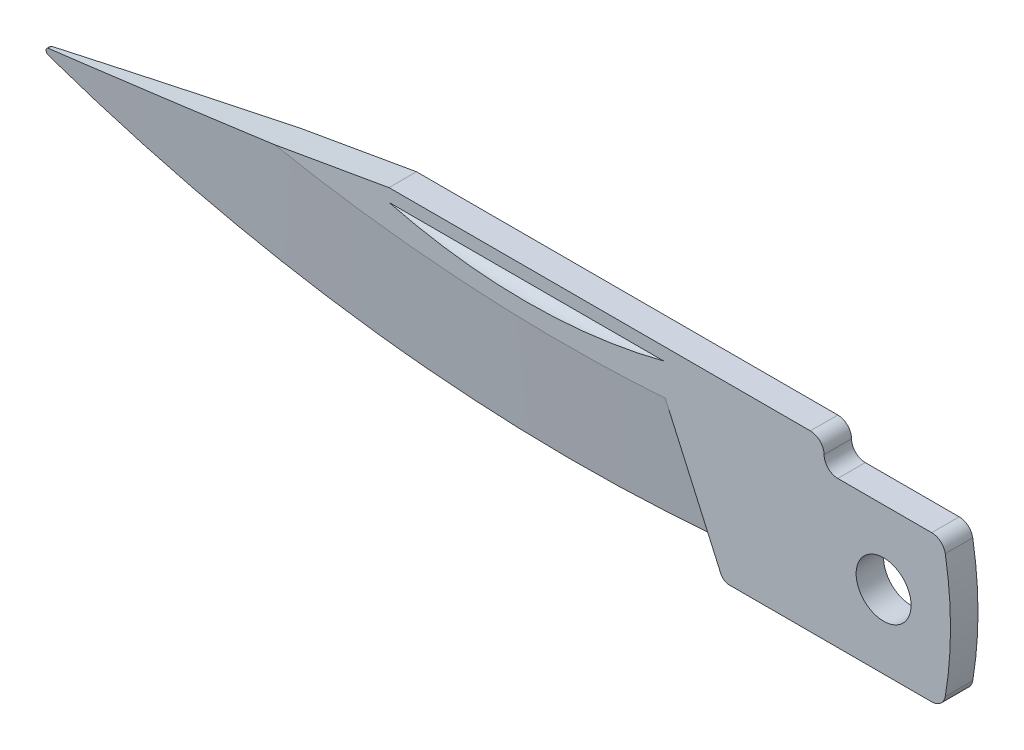
ISO-10303-21;
HEADER;
FILE_DESCRIPTION(('STEP AP214'),'2;1');
FILE_NAME('part.step','',(''),(''),'','','');
FILE_SCHEMA(('AUTOMOTIVE_DESIGN { 1 0 10303 214 1 1 1 1 }'));
ENDSEC;
DATA;
#1=APPLICATION_CONTEXT('core data for automotive mechanical design processes');
#2=APPLICATION_PROTOCOL_DEFINITION('international standard','automotive_design',2000,#1);
#3=PRODUCT_CONTEXT('',#1,'mechanical');
#4=PRODUCT('Part','Part','',(#3));
#5=PRODUCT_RELATED_PRODUCT_CATEGORY('part','',(#4));
#6=PRODUCT_DEFINITION_FORMATION('','',#4);
#7=PRODUCT_DEFINITION_CONTEXT('part definition',#1,'design');
#8=PRODUCT_DEFINITION('design','',#6,#7);
#9=PRODUCT_DEFINITION_SHAPE('','',#8);
#10=(LENGTH_UNIT() NAMED_UNIT(*) SI_UNIT(.MILLI.,.METRE.));
#11=(NAMED_UNIT(*) PLANE_ANGLE_UNIT() SI_UNIT($,.RADIAN.));
#12=(NAMED_UNIT(*) SI_UNIT($,.STERADIAN.) SOLID_ANGLE_UNIT());
#13=UNCERTAINTY_MEASURE_WITH_UNIT(LENGTH_MEASURE(1.E-05),#10,'distance_accuracy_value','');
#14=(GEOMETRIC_REPRESENTATION_CONTEXT(3) GLOBAL_UNCERTAINTY_ASSIGNED_CONTEXT((#13)) GLOBAL_UNIT_ASSIGNED_CONTEXT((#10,
#11,#12)) REPRESENTATION_CONTEXT('',''));
#15=CARTESIAN_POINT('',(0.,0.,0.));
#16=DIRECTION('',(0.,0.,1.));
#17=DIRECTION('',(1.,0.,0.));
#18=AXIS2_PLACEMENT_3D('',#15,#16,#17);
#19=CARTESIAN_POINT('',(-16.3459179422654,0.,0.75));
#20=DIRECTION('',(0.,0.,-1.));
#21=DIRECTION('',(-1.,0.,0.));
#22=AXIS2_PLACEMENT_3D('',#19,#20,#21);
#23=PLANE('',#22);
#24=DIRECTION('',(-1.,0.,0.));
#25=VECTOR('',#24,1.);
#26=CARTESIAN_POINT('',(-27.,4.8,0.75));
#27=LINE('',#26,#25);
#28=CARTESIAN_POINT('',(-12.,4.8,0.75));
#29=VERTEX_POINT('',#28);
#30=CARTESIAN_POINT('',(-27.,4.8,0.75));
#31=VERTEX_POINT('',#30);
#32=EDGE_CURVE('E149',#29,#31,#27,.T.);
#33=ORIENTED_EDGE('',*,*,#32,.F.);
#34=CARTESIAN_POINT('',(-19.5,33.8473750965556,0.75));
#35=DIRECTION('',(0.,0.,1.));
#36=DIRECTION('',(-1.,0.,0.));
#37=AXIS2_PLACEMENT_3D('',#34,#35,#36);
#38=CIRCLE('',#37,30.);
#39=EDGE_CURVE('E160',#31,#29,#38,.T.);
#40=ORIENTED_EDGE('',*,*,#39,.F.);
#41=EDGE_LOOP('',(#33,#40));
#42=FACE_BOUND('',#41,.T.);
#43=CARTESIAN_POINT('',(0.,0.,0.75));
#44=DIRECTION('',(0.,0.,1.));
#45=DIRECTION('',(1.,0.,0.));
#46=AXIS2_PLACEMENT_3D('',#43,#44,#45);
#47=CIRCLE('',#46,1.5);
#48=CARTESIAN_POINT('',(1.5,0.,0.75));
#49=VERTEX_POINT('',#48);
#50=EDGE_CURVE('E453',#49,#49,#47,.T.);
#51=ORIENTED_EDGE('',*,*,#50,.F.);
#52=EDGE_LOOP('',(#51));
#53=FACE_BOUND('',#52,.T.);
#54=DIRECTION('',(0.408366060058254,-0.91281825189492,0.));
#55=VECTOR('',#54,1.);
#56=CARTESIAN_POINT('',(-8.75,-4.,0.75));
#57=LINE('',#56,#55);
#58=CARTESIAN_POINT('',(-11.9180941663228,3.08162140985568,0.750000000000002));
#59=VERTEX_POINT('',#58);
#60=CARTESIAN_POINT('',(-8.88233917077645,-3.70418303002913,0.75));
#61=VERTEX_POINT('',#60);
#62=EDGE_CURVE('E466',#59,#61,#57,.T.);
#63=ORIENTED_EDGE('',*,*,#62,.T.);
#64=CARTESIAN_POINT('',(-8.42593004482898,-3.5,0.75));
#65=DIRECTION('',(0.,0.,-1.));
#66=DIRECTION('',(-1.,0.,0.));
#67=AXIS2_PLACEMENT_3D('',#64,#65,#66);
#68=CIRCLE('',#67,0.5);
#69=CARTESIAN_POINT('',(-8.42593004482898,-4.,0.75));
#70=VERTEX_POINT('',#69);
#71=EDGE_CURVE('E11',#61,#70,#68,.F.);
#72=ORIENTED_EDGE('',*,*,#71,.T.);
#73=DIRECTION('',(1.,0.,0.));
#74=VECTOR('',#73,1.);
#75=CARTESIAN_POINT('',(3.25,-4.,0.75));
#76=LINE('',#75,#74);
#77=CARTESIAN_POINT('',(2.62774801874485,-4.,0.75));
#78=VERTEX_POINT('',#77);
#79=EDGE_CURVE('E405',#70,#78,#76,.T.);
#80=ORIENTED_EDGE('',*,*,#79,.T.);
#81=CARTESIAN_POINT('',(2.62774801874485,-3.25,0.75));
#82=DIRECTION('',(0.,0.,-1.));
#83=DIRECTION('',(-1.,0.,0.));
#84=AXIS2_PLACEMENT_3D('',#81,#82,#83);
#85=CIRCLE('',#84,0.75);
#86=CARTESIAN_POINT('',(3.36698175748551,-3.37662337662338,0.75));
#87=VERTEX_POINT('',#86);
#88=EDGE_CURVE('E384',#78,#87,#85,.F.);
#89=ORIENTED_EDGE('',*,*,#88,.T.);
#90=CARTESIAN_POINT('',(-16.3459179422654,0.,0.75));
#91=DIRECTION('',(0.,0.,1.));
#92=DIRECTION('',(-1.,0.,0.));
#93=AXIS2_PLACEMENT_3D('',#90,#91,#92);
#94=CIRCLE('',#93,20.);
#95=CARTESIAN_POINT('',(3.36698175748551,3.37662337662338,0.75));
#96=VERTEX_POINT('',#95);
#97=EDGE_CURVE('E446',#87,#96,#94,.T.);
#98=ORIENTED_EDGE('',*,*,#97,.T.);
#99=CARTESIAN_POINT('',(2.62774801874485,3.25,0.75));
#100=DIRECTION('',(0.,0.,-1.));
#101=DIRECTION('',(-1.,0.,0.));
#102=AXIS2_PLACEMENT_3D('',#99,#100,#101);
#103=CIRCLE('',#102,0.75);
#104=CARTESIAN_POINT('',(2.62774801874485,4.,0.75));
#105=VERTEX_POINT('',#104);
#106=EDGE_CURVE('E382',#96,#105,#103,.F.);
#107=ORIENTED_EDGE('',*,*,#106,.T.);
#108=DIRECTION('',(-1.,0.,0.));
#109=VECTOR('',#108,1.);
#110=CARTESIAN_POINT('',(-3.25,4.,0.75));
#111=LINE('',#110,#109);
#112=CARTESIAN_POINT('',(-2.5,4.,0.75));
#113=VERTEX_POINT('',#112);
#114=EDGE_CURVE('E443',#105,#113,#111,.T.);
#115=ORIENTED_EDGE('',*,*,#114,.T.);
#116=CARTESIAN_POINT('',(-2.5,4.75,0.75));
#117=DIRECTION('',(0.,0.,-1.));
#118=DIRECTION('',(-1.,0.,0.));
#119=AXIS2_PLACEMENT_3D('',#116,#117,#118);
#120=CIRCLE('',#119,0.75);
#121=CARTESIAN_POINT('',(-3.25,4.75,0.75));
#122=VERTEX_POINT('',#121);
#123=EDGE_CURVE('E396',#113,#122,#120,.T.);
#124=ORIENTED_EDGE('',*,*,#123,.T.);
#125=CARTESIAN_POINT('',(-4.,4.75,0.75));
#126=DIRECTION('',(0.,0.,-1.));
#127=DIRECTION('',(-1.,0.,0.));
#128=AXIS2_PLACEMENT_3D('',#125,#126,#127);
#129=CIRCLE('',#128,0.75);
#130=CARTESIAN_POINT('',(-4.,5.5,0.75));
#131=VERTEX_POINT('',#130);
#132=EDGE_CURVE('E380',#122,#131,#129,.F.);
#133=ORIENTED_EDGE('',*,*,#132,.T.);
#134=DIRECTION('',(-1.,0.,0.));
#135=VECTOR('',#134,1.);
#136=CARTESIAN_POINT('',(-13.,5.5,0.75));
#137=LINE('',#136,#135);
#138=CARTESIAN_POINT('',(-27.,5.5,0.75));
#139=VERTEX_POINT('',#138);
#140=EDGE_CURVE('E424',#131,#139,#137,.T.);
#141=ORIENTED_EDGE('',*,*,#140,.T.);
#142=DIRECTION('',(-0.985030467155704,-0.172380331752248,0.));
#143=VECTOR('',#142,1.);
#144=CARTESIAN_POINT('',(-27.,5.5,0.75));
#145=LINE('',#144,#143);
#146=CARTESIAN_POINT('',(-33.2378126812052,4.40838278078443,0.749999999999946));
#147=VERTEX_POINT('',#146);
#148=EDGE_CURVE('E425',#139,#147,#145,.T.);
#149=ORIENTED_EDGE('',*,*,#148,.T.);
#150=CARTESIAN_POINT('',(-48.4118995852558,8.91426390720311,0.750000000000003));
#151=CARTESIAN_POINT('',(-47.6273473826281,8.6041792015523,0.750000000000003));
#152=CARTESIAN_POINT('',(-46.8445950996885,8.3029019324848,0.750000000000003));
#153=CARTESIAN_POINT('',(-45.2827052618719,7.72469085103924,0.750000000000003));
#154=CARTESIAN_POINT('',(-44.5052915096354,7.44853873558781,0.750000000000003));
#155=CARTESIAN_POINT('',(-42.9474323015971,6.92386391716868,0.750000000000003));
#156=CARTESIAN_POINT('',(-42.1599239030951,6.67133722632486,0.750000000000003));
#157=CARTESIAN_POINT('',(-40.5791430949942,6.19111776470088,0.750000000000003));
#158=CARTESIAN_POINT('',(-39.7840821385603,5.96262018037788,0.750000000000051));
#159=CARTESIAN_POINT('',(-35.7891504623996,4.87990866051605,0.749999999999811));
#160=CARTESIAN_POINT('',(-32.5253521841167,4.20372394082572,0.750000000000002));
#161=CARTESIAN_POINT('',(-25.9349337441351,3.25386512255557,0.750000000000002));
#162=CARTESIAN_POINT('',(-22.6042335913684,2.97921491743926,0.750000000000001));
#163=CARTESIAN_POINT('',(-15.9499476353999,2.83734182266262,0.750000000000001));
#164=CARTESIAN_POINT('',(-12.6213699597276,2.96954306789259,0.75));
#165=CARTESIAN_POINT('',(-8.8409969324299,3.34927857939747,0.75));
#166=CARTESIAN_POINT('',(-8.34374512547456,3.40335837983422,0.75));
#167=CARTESIAN_POINT('',(-7.84728512130977,3.46091599863165,0.75));
#168=B_SPLINE_CURVE_WITH_KNOTS('',3,(#150,#151,#152,#153,#154,#155,#156,#157,#158,#159,#160,
#161,#162,#163,#164,#165,#166,#167),.UNSPECIFIED.,.F.,.F.,(4,2,2,2,2,2,2,2,4),(0.,
0.0602537035642235,0.120507407128447,0.180761110692671,0.241014814256894,0.482029628513788,
0.723044442770682,0.964059257027577,1.),.UNSPECIFIED.);
#169=EDGE_CURVE('E288',#147,#59,#168,.T.);
#170=ORIENTED_EDGE('',*,*,#169,.T.);
#171=EDGE_LOOP('',(#63,#72,#80,#89,#98,#107,#115,#124,#133,#141,#149,#170));
#172=FACE_BOUND('',#171,.T.);
#173=ADVANCED_FACE('F39',(#42,#53,#172),#23,.F.);
#174=CARTESIAN_POINT('',(-17.5267022797642,84.9175778800511,0.75));
#175=DIRECTION('',(0.,0.,-1.));
#176=DIRECTION('',(-1.,0.,0.));
#177=AXIS2_PLACEMENT_3D('',#174,#175,#176);
#178=CYLINDRICAL_SURFACE('',#177,88.);
#179=CARTESIAN_POINT('',(-51.1462661854821,3.57354866525593,0.0499999999999997));
#180=CARTESIAN_POINT('',(-50.3332171944476,3.24887432494023,0.0499999999999997));
#181=CARTESIAN_POINT('',(-49.5147465972766,2.92957934963637,0.0499999999999998));
#182=CARTESIAN_POINT('',(-47.8665360793661,2.30933094561308,0.0499999999999998));
#183=CARTESIAN_POINT('',(-47.0367960982176,2.0083776621206,0.0500000000000002));
#184=CARTESIAN_POINT('',(-45.3656209410114,1.4323948766627,0.0500000000000002));
#185=CARTESIAN_POINT('',(-44.5245052322645,1.15659307937648,0.0499999999999644));
#186=CARTESIAN_POINT('',(-42.832230770165,0.629890939930534,0.0500000000000365));
#187=CARTESIAN_POINT('',(-41.9810719584124,0.378990737539784,0.0500000000000337));
#188=CARTESIAN_POINT('',(-37.7027021009008,-0.811948004969777,0.0499999999998682));
#189=CARTESIAN_POINT('',(-34.207591273421,-1.56080374322996,0.0500000000000003));
#190=CARTESIAN_POINT('',(-27.1428552370983,-2.628365189016,0.0500000000000003));
#191=CARTESIAN_POINT('',(-23.5733817425332,-2.94703267092562,0.0500000000000002));
#192=CARTESIAN_POINT('',(-16.434189677219,-3.1480711342927,0.0500000000000002));
#193=CARTESIAN_POINT('',(-12.8646352909017,-3.0304569383969,0.0499999999999399));
#194=CARTESIAN_POINT('',(-8.80472058664266,-2.65072141966462,0.050000000000009));
#195=CARTESIAN_POINT('',(-8.27469066528119,-2.59631508974074,0.0499999999999998));
#196=CARTESIAN_POINT('',(-7.74809196639785,-2.53826400517042,0.0499999999999998));
#197=B_SPLINE_CURVE_WITH_KNOTS('',3,(#179,#180,#181,#182,#183,#184,#185,#186,#187,#188,#189,
#190,#191,#192,#193,#194,#195,#196),.UNSPECIFIED.,.F.,.F.,(4,2,2,2,2,2,2,2,4),(0.,
0.0602537035642235,0.120507407128447,0.180761110692671,0.241014814256894,0.482029628513788,
0.723044442770682,0.964059257027577,1.),.UNSPECIFIED.);
#198=CARTESIAN_POINT('',(-46.27574517798,1.7461143718512,0.0500000000000001));
#199=VERTEX_POINT('',#198);
#200=CARTESIAN_POINT('',(-9.33157894736845,-2.70000000000001,0.05));
#201=VERTEX_POINT('',#200);
#202=EDGE_CURVE('E228',#199,#201,#197,.T.);
#203=ORIENTED_EDGE('',*,*,#202,.F.);
#204=DIRECTION('',(0.,0.,-1.));
#205=VECTOR('',#204,1.);
#206=CARTESIAN_POINT('',(-46.2757455314587,1.74611334976765,0.75));
#207=LINE('',#206,#205);
#208=CARTESIAN_POINT('',(-46.27574517798,1.74611437185121,-0.0499999999999998));
#209=VERTEX_POINT('',#208);
#210=EDGE_CURVE('E236',#199,#209,#207,.T.);
#211=ORIENTED_EDGE('',*,*,#210,.T.);
#212=CARTESIAN_POINT('',(-51.1462661854821,3.57354866525593,-0.0500000000000003));
#213=CARTESIAN_POINT('',(-50.3332171944476,3.24887432494023,-0.0500000000000003));
#214=CARTESIAN_POINT('',(-49.5147465972766,2.92957934963637,-0.0500000000000002));
#215=CARTESIAN_POINT('',(-47.8665360793661,2.30933094561308,-0.0500000000000002));
#216=CARTESIAN_POINT('',(-47.0367960982176,2.0083776621206,-0.0499999999999999));
#217=CARTESIAN_POINT('',(-45.3656209410114,1.4323948766627,-0.0499999999999999));
#218=CARTESIAN_POINT('',(-44.5245052322645,1.15659307937648,-0.0500000000000356));
#219=CARTESIAN_POINT('',(-42.832230770165,0.629890939930534,-0.0499999999999636));
#220=CARTESIAN_POINT('',(-41.9810719584124,0.378990737539784,-0.0499999999999663));
#221=CARTESIAN_POINT('',(-37.7027021009008,-0.811948004969777,-0.0500000000001319));
#222=CARTESIAN_POINT('',(-34.207591273421,-1.56080374322996,-0.0499999999999998));
#223=CARTESIAN_POINT('',(-27.1428552370983,-2.628365189016,-0.0499999999999998));
#224=CARTESIAN_POINT('',(-23.5733817425332,-2.94703267092562,-0.0499999999999998));
#225=CARTESIAN_POINT('',(-16.434189677219,-3.1480711342927,-0.0499999999999998));
#226=CARTESIAN_POINT('',(-12.8646352909017,-3.0304569383969,-0.0500000000000601));
#227=CARTESIAN_POINT('',(-8.80472058664266,-2.65072141966462,-0.0499999999999911));
#228=CARTESIAN_POINT('',(-8.27469066528119,-2.59631508974074,-0.0500000000000003));
#229=CARTESIAN_POINT('',(-7.74809196639785,-2.53826400517042,-0.0500000000000003));
#230=B_SPLINE_CURVE_WITH_KNOTS('',3,(#212,#213,#214,#215,#216,#217,#218,#219,#220,#221,#222,
#223,#224,#225,#226,#227,#228,#229),.UNSPECIFIED.,.F.,.F.,(4,2,2,2,2,2,2,2,4),(0.,
0.0602537035642235,0.120507407128447,0.180761110692671,0.241014814256894,0.482029628513788,
0.723044442770682,0.964059257027577,1.),.UNSPECIFIED.);
#231=CARTESIAN_POINT('',(-9.33157894736846,-2.7,-0.0499999999999999));
#232=VERTEX_POINT('',#231);
#233=EDGE_CURVE('E221',#209,#232,#230,.T.);
#234=ORIENTED_EDGE('',*,*,#233,.T.);
#235=DIRECTION('',(0.,0.,-1.));
#236=VECTOR('',#235,1.);
#237=CARTESIAN_POINT('',(-9.33157894736845,-2.70000000000001,0.75));
#238=LINE('',#237,#236);
#239=EDGE_CURVE('E241',#201,#232,#238,.T.);
#240=ORIENTED_EDGE('',*,*,#239,.F.);
#241=EDGE_LOOP('',(#203,#211,#234,#240));
#242=FACE_BOUND('',#241,.T.);
#243=ADVANCED_FACE('F246',(#242),#178,.T.);
#244=CARTESIAN_POINT('',(-16.3459179422654,0.,-0.75));
#245=DIRECTION('',(0.,0.,-1.));
#246=DIRECTION('',(-1.,0.,0.));
#247=AXIS2_PLACEMENT_3D('',#244,#245,#246);
#248=PLANE('',#247);
#249=DIRECTION('',(1.,0.,0.));
#250=VECTOR('',#249,1.);
#251=CARTESIAN_POINT('',(3.25,-4.,-0.75));
#252=LINE('',#251,#250);
#253=CARTESIAN_POINT('',(-8.42593004482898,-4.,-0.75));
#254=VERTEX_POINT('',#253);
#255=CARTESIAN_POINT('',(2.62774801874485,-4.,-0.75));
#256=VERTEX_POINT('',#255);
#257=EDGE_CURVE('E404',#254,#256,#252,.T.);
#258=ORIENTED_EDGE('',*,*,#257,.F.);
#259=CARTESIAN_POINT('',(-8.42593004482898,-3.5,-0.75));
#260=DIRECTION('',(0.,0.,-1.));
#261=DIRECTION('',(-1.,0.,0.));
#262=AXIS2_PLACEMENT_3D('',#259,#260,#261);
#263=CIRCLE('',#262,0.5);
#264=CARTESIAN_POINT('',(-8.88233917077645,-3.70418303002913,-0.75));
#265=VERTEX_POINT('',#264);
#266=EDGE_CURVE('E61',#254,#265,#263,.T.);
#267=ORIENTED_EDGE('',*,*,#266,.T.);
#268=DIRECTION('',(0.408366060058254,-0.91281825189492,0.));
#269=VECTOR('',#268,1.);
#270=CARTESIAN_POINT('',(-8.75,-4.,-0.75));
#271=LINE('',#270,#269);
#272=CARTESIAN_POINT('',(-11.918094213187,3.08162209406134,-0.749999999999997));
#273=VERTEX_POINT('',#272);
#274=EDGE_CURVE('E412',#273,#265,#271,.T.);
#275=ORIENTED_EDGE('',*,*,#274,.F.);
#276=CARTESIAN_POINT('',(-48.4118995852558,8.91426390720311,-0.749999999999998));
#277=CARTESIAN_POINT('',(-47.6273473826281,8.6041792015523,-0.749999999999998));
#278=CARTESIAN_POINT('',(-46.8445950996885,8.3029019324848,-0.749999999999998));
#279=CARTESIAN_POINT('',(-45.2827052618719,7.72469085103924,-0.749999999999998));
#280=CARTESIAN_POINT('',(-44.5052915096354,7.44853873558781,-0.749999999999997));
#281=CARTESIAN_POINT('',(-42.9474323015971,6.92386391716868,-0.749999999999997));
#282=CARTESIAN_POINT('',(-42.1599239030951,6.67133722632486,-0.749999999999997));
#283=CARTESIAN_POINT('',(-40.5791430949942,6.19111776470088,-0.749999999999997));
#284=CARTESIAN_POINT('',(-39.7840821385603,5.96262018037788,-0.749999999999949));
#285=CARTESIAN_POINT('',(-35.7891504623996,4.87990866051605,-0.75000000000019));
#286=CARTESIAN_POINT('',(-32.5253521841167,4.20372394082572,-0.749999999999998));
#287=CARTESIAN_POINT('',(-25.9349337441351,3.25386512255557,-0.749999999999998));
#288=CARTESIAN_POINT('',(-22.6042335913684,2.97921491743926,-0.749999999999999));
#289=CARTESIAN_POINT('',(-15.9499476353999,2.83734182266262,-0.749999999999999));
#290=CARTESIAN_POINT('',(-12.6213699597276,2.96954306789259,-0.75));
#291=CARTESIAN_POINT('',(-8.8409969324299,3.34927857939747,-0.75));
#292=CARTESIAN_POINT('',(-8.34374512547456,3.40335837983422,-0.750000000000001));
#293=CARTESIAN_POINT('',(-7.84728512130977,3.46091599863165,-0.750000000000001));
#294=B_SPLINE_CURVE_WITH_KNOTS('',3,(#276,#277,#278,#279,#280,#281,#282,#283,#284,#285,#286,
#287,#288,#289,#290,#291,#292,#293),.UNSPECIFIED.,.F.,.F.,(4,2,2,2,2,2,2,2,4),(0.,
0.0602537035642235,0.120507407128447,0.180761110692671,0.241014814256894,0.482029628513788,
0.723044442770682,0.964059257027577,1.),.UNSPECIFIED.);
#295=CARTESIAN_POINT('',(-33.2378126812032,4.40838278078665,-0.750000000000054));
#296=VERTEX_POINT('',#295);
#297=EDGE_CURVE('E156',#296,#273,#294,.T.);
#298=ORIENTED_EDGE('',*,*,#297,.F.);
#299=DIRECTION('',(-0.985030467155704,-0.172380331752248,0.));
#300=VECTOR('',#299,1.);
#301=CARTESIAN_POINT('',(-27.,5.5,-0.75));
#302=LINE('',#301,#300);
#303=CARTESIAN_POINT('',(-27.,5.5,-0.75));
#304=VERTEX_POINT('',#303);
#305=EDGE_CURVE('E428',#304,#296,#302,.T.);
#306=ORIENTED_EDGE('',*,*,#305,.F.);
#307=DIRECTION('',(-1.,0.,0.));
#308=VECTOR('',#307,1.);
#309=CARTESIAN_POINT('',(-13.,5.5,-0.75));
#310=LINE('',#309,#308);
#311=CARTESIAN_POINT('',(-4.,5.5,-0.75));
#312=VERTEX_POINT('',#311);
#313=EDGE_CURVE('E417',#312,#304,#310,.T.);
#314=ORIENTED_EDGE('',*,*,#313,.F.);
#315=CARTESIAN_POINT('',(-4.,4.75,-0.75));
#316=DIRECTION('',(0.,0.,-1.));
#317=DIRECTION('',(-1.,0.,0.));
#318=AXIS2_PLACEMENT_3D('',#315,#316,#317);
#319=CIRCLE('',#318,0.75);
#320=CARTESIAN_POINT('',(-3.25,4.75,-0.75));
#321=VERTEX_POINT('',#320);
#322=EDGE_CURVE('E370',#312,#321,#319,.T.);
#323=ORIENTED_EDGE('',*,*,#322,.T.);
#324=CARTESIAN_POINT('',(-2.5,4.75,-0.75));
#325=DIRECTION('',(0.,0.,-1.));
#326=DIRECTION('',(-1.,0.,0.));
#327=AXIS2_PLACEMENT_3D('',#324,#325,#326);
#328=CIRCLE('',#327,0.75);
#329=CARTESIAN_POINT('',(-2.5,4.,-0.75));
#330=VERTEX_POINT('',#329);
#331=EDGE_CURVE('E394',#321,#330,#328,.F.);
#332=ORIENTED_EDGE('',*,*,#331,.T.);
#333=DIRECTION('',(-1.,0.,0.));
#334=VECTOR('',#333,1.);
#335=CARTESIAN_POINT('',(-3.25,4.,-0.75));
#336=LINE('',#335,#334);
#337=CARTESIAN_POINT('',(2.62774801874485,4.,-0.75));
#338=VERTEX_POINT('',#337);
#339=EDGE_CURVE('E415',#338,#330,#336,.T.);
#340=ORIENTED_EDGE('',*,*,#339,.F.);
#341=CARTESIAN_POINT('',(2.62774801874485,3.25,-0.75));
#342=DIRECTION('',(0.,0.,-1.));
#343=DIRECTION('',(-1.,0.,0.));
#344=AXIS2_PLACEMENT_3D('',#341,#342,#343);
#345=CIRCLE('',#344,0.75);
#346=CARTESIAN_POINT('',(3.36698175748551,3.37662337662338,-0.75));
#347=VERTEX_POINT('',#346);
#348=EDGE_CURVE('E372',#338,#347,#345,.T.);
#349=ORIENTED_EDGE('',*,*,#348,.T.);
#350=CARTESIAN_POINT('',(-16.3459179422654,0.,-0.75));
#351=DIRECTION('',(0.,0.,1.));
#352=DIRECTION('',(-1.,0.,0.));
#353=AXIS2_PLACEMENT_3D('',#350,#351,#352);
#354=CIRCLE('',#353,20.);
#355=CARTESIAN_POINT('',(3.36698175748551,-3.37662337662338,-0.75));
#356=VERTEX_POINT('',#355);
#357=EDGE_CURVE('E411',#356,#347,#354,.T.);
#358=ORIENTED_EDGE('',*,*,#357,.F.);
#359=CARTESIAN_POINT('',(2.62774801874485,-3.25,-0.75));
#360=DIRECTION('',(0.,0.,-1.));
#361=DIRECTION('',(-1.,0.,0.));
#362=AXIS2_PLACEMENT_3D('',#359,#360,#361);
#363=CIRCLE('',#362,0.75);
#364=EDGE_CURVE('E374',#356,#256,#363,.T.);
#365=ORIENTED_EDGE('',*,*,#364,.T.);
#366=EDGE_LOOP('',(#258,#267,#275,#298,#306,#314,#323,#332,#340,#349,#358,#365));
#367=FACE_BOUND('',#366,.T.);
#368=CARTESIAN_POINT('',(0.,0.,-0.75));
#369=DIRECTION('',(0.,0.,1.));
#370=DIRECTION('',(1.,0.,0.));
#371=AXIS2_PLACEMENT_3D('',#368,#369,#370);
#372=CIRCLE('',#371,1.5);
#373=CARTESIAN_POINT('',(1.5,0.,-0.75));
#374=VERTEX_POINT('',#373);
#375=EDGE_CURVE('E457',#374,#374,#372,.T.);
#376=ORIENTED_EDGE('',*,*,#375,.T.);
#377=EDGE_LOOP('',(#376));
#378=FACE_BOUND('',#377,.T.);
#379=ADVANCED_FACE('F255',(#367,#378),#248,.T.);
#380=CARTESIAN_POINT('',(-13.,5.5,0.75));
#381=DIRECTION('',(0.,-1.,0.));
#382=DIRECTION('',(0.,0.,-1.));
#383=AXIS2_PLACEMENT_3D('',#380,#381,#382);
#384=PLANE('',#383);
#385=ORIENTED_EDGE('',*,*,#140,.F.);
#386=DIRECTION('',(0.,0.,-1.));
#387=VECTOR('',#386,1.);
#388=CARTESIAN_POINT('',(-4.,5.5,0.75));
#389=LINE('',#388,#387);
#390=EDGE_CURVE('E392',#131,#312,#389,.T.);
#391=ORIENTED_EDGE('',*,*,#390,.T.);
#392=ORIENTED_EDGE('',*,*,#313,.T.);
#393=DIRECTION('',(0.,0.,-1.));
#394=VECTOR('',#393,1.);
#395=CARTESIAN_POINT('',(-27.,5.5,0.75));
#396=LINE('',#395,#394);
#397=EDGE_CURVE('E461',#139,#304,#396,.T.);
#398=ORIENTED_EDGE('',*,*,#397,.F.);
#399=EDGE_LOOP('',(#385,#391,#392,#398));
#400=FACE_BOUND('',#399,.T.);
#401=ADVANCED_FACE('F271',(#400),#384,.F.);
#402=CARTESIAN_POINT('',(-8.75,-4.,0.75));
#403=DIRECTION('',(0.91281825189492,0.408366060058254,0.));
#404=DIRECTION('',(-0.408366060058254,0.912818251894921,0.));
#405=AXIS2_PLACEMENT_3D('',#402,#403,#404);
#406=PLANE('',#405);
#407=ORIENTED_EDGE('',*,*,#274,.T.);
#408=DIRECTION('',(0.,0.,-1.));
#409=VECTOR('',#408,1.);
#410=CARTESIAN_POINT('',(-8.88233917077645,-3.70418303002913,0.75));
#411=LINE('',#410,#409);
#412=EDGE_CURVE('E47',#265,#61,#411,.F.);
#413=ORIENTED_EDGE('',*,*,#412,.T.);
#414=ORIENTED_EDGE('',*,*,#62,.F.);
#415=CARTESIAN_POINT('',(-9.33157894736846,-2.7,0.05));
#416=CARTESIAN_POINT('',(-9.54711164820292,-2.21822102166411,0.108559358994032));
#417=CARTESIAN_POINT('',(-9.76264672396609,-1.73643673466405,0.167066314713739));
#418=CARTESIAN_POINT('',(-10.1937218937836,-0.772856943307226,0.28396926244474));
#419=CARTESIAN_POINT('',(-10.4092619878379,-0.29106143895046,0.342365254455969));
#420=CARTESIAN_POINT('',(-11.0558902976546,1.15434301828671,0.517377575593648));
#421=CARTESIAN_POINT('',(-11.4869864431367,2.11796969642315,0.633818223210209));
#422=CARTESIAN_POINT('',(-11.9180942348161,3.08162240723604,0.750000000058542));
#423=B_SPLINE_CURVE_WITH_KNOTS('',3,(#415,#416,#417,#418,#419,#420,#421,#422),.UNSPECIFIED.,.F.,
.F.,(4,2,2,4),(0.,1.59309470754365,3.18618941600469,6.37237955679931),.UNSPECIFIED.);
#424=EDGE_CURVE('E176',#201,#59,#423,.T.);
#425=ORIENTED_EDGE('',*,*,#424,.F.);
#426=ORIENTED_EDGE('',*,*,#239,.T.);
#427=CARTESIAN_POINT('',(-11.9180942354872,3.0816224069429,-0.75));
#428=CARTESIAN_POINT('',(-11.4869865375571,2.11796990698236,-0.633818248589841));
#429=CARTESIAN_POINT('',(-11.0558904861547,1.15434343954033,-0.51737762649508));
#430=CARTESIAN_POINT('',(-10.4092622283007,-0.291060901395572,-0.342365319596662));
#431=CARTESIAN_POINT('',(-10.1937220920509,-0.772856500096576,-0.283969316188937));
#432=CARTESIAN_POINT('',(-9.76264682802275,-1.73643650209171,-0.167066342956513));
#433=CARTESIAN_POINT('',(-9.54711170024464,-2.21822090538533,-0.108559373126821));
#434=CARTESIAN_POINT('',(-9.33157894736843,-2.70000000000001,-0.0499999999999999));
#435=B_SPLINE_CURVE_WITH_KNOTS('',3,(#427,#428,#429,#430,#431,#432,#433,#434),.UNSPECIFIED.,.F.,
.F.,(4,2,2,4),(0.,3.18618944433924,4.77928446473064,6.37237955679936),.UNSPECIFIED.);
#436=EDGE_CURVE('E304',#273,#232,#435,.T.);
#437=ORIENTED_EDGE('',*,*,#436,.F.);
#438=EDGE_LOOP('',(#407,#413,#414,#425,#426,#437));
#439=FACE_BOUND('',#438,.T.);
#440=ADVANCED_FACE('F322',(#439),#406,.F.);
#441=CARTESIAN_POINT('',(3.25,-4.,0.75));
#442=DIRECTION('',(0.,1.,0.));
#443=DIRECTION('',(-1.,0.,0.));
#444=AXIS2_PLACEMENT_3D('',#441,#442,#443);
#445=PLANE('',#444);
#446=ORIENTED_EDGE('',*,*,#79,.F.);
#447=DIRECTION('',(0.,0.,-1.));
#448=VECTOR('',#447,1.);
#449=CARTESIAN_POINT('',(-8.42593004482898,-4.,0.75));
#450=LINE('',#449,#448);
#451=EDGE_CURVE('E397',#70,#254,#450,.T.);
#452=ORIENTED_EDGE('',*,*,#451,.T.);
#453=ORIENTED_EDGE('',*,*,#257,.T.);
#454=DIRECTION('',(0.,0.,-1.));
#455=VECTOR('',#454,1.);
#456=CARTESIAN_POINT('',(2.62774801874485,-4.,0.75));
#457=LINE('',#456,#455);
#458=EDGE_CURVE('E377',#256,#78,#457,.F.);
#459=ORIENTED_EDGE('',*,*,#458,.T.);
#460=EDGE_LOOP('',(#446,#452,#453,#459));
#461=FACE_BOUND('',#460,.T.);
#462=ADVANCED_FACE('F327',(#461),#445,.F.);
#463=CARTESIAN_POINT('',(-16.3459179422654,0.,0.75));
#464=DIRECTION('',(0.,0.,-1.));
#465=DIRECTION('',(-1.,0.,0.));
#466=AXIS2_PLACEMENT_3D('',#463,#464,#465);
#467=CYLINDRICAL_SURFACE('',#466,20.);
#468=ORIENTED_EDGE('',*,*,#97,.F.);
#469=DIRECTION('',(0.,0.,-1.));
#470=VECTOR('',#469,1.);
#471=CARTESIAN_POINT('',(3.36698175748551,-3.37662337662338,0.75));
#472=LINE('',#471,#470);
#473=EDGE_CURVE('E367',#87,#356,#472,.T.);
#474=ORIENTED_EDGE('',*,*,#473,.T.);
#475=ORIENTED_EDGE('',*,*,#357,.T.);
#476=DIRECTION('',(0.,0.,-1.));
#477=VECTOR('',#476,1.);
#478=CARTESIAN_POINT('',(3.36698175748551,3.37662337662338,0.75));
#479=LINE('',#478,#477);
#480=EDGE_CURVE('E365',#347,#96,#479,.F.);
#481=ORIENTED_EDGE('',*,*,#480,.T.);
#482=EDGE_LOOP('',(#468,#474,#475,#481));
#483=FACE_BOUND('',#482,.T.);
#484=ADVANCED_FACE('F474',(#483),#467,.T.);
#485=CARTESIAN_POINT('',(-3.25,4.,0.75));
#486=DIRECTION('',(0.,-1.,0.));
#487=DIRECTION('',(0.,0.,-1.));
#488=AXIS2_PLACEMENT_3D('',#485,#486,#487);
#489=PLANE('',#488);
#490=ORIENTED_EDGE('',*,*,#114,.F.);
#491=DIRECTION('',(0.,0.,-1.));
#492=VECTOR('',#491,1.);
#493=CARTESIAN_POINT('',(2.62774801874485,4.,0.75));
#494=LINE('',#493,#492);
#495=EDGE_CURVE('E389',#105,#338,#494,.T.);
#496=ORIENTED_EDGE('',*,*,#495,.T.);
#497=ORIENTED_EDGE('',*,*,#339,.T.);
#498=DIRECTION('',(0.,0.,-1.));
#499=VECTOR('',#498,1.);
#500=CARTESIAN_POINT('',(-2.5,4.,0.75));
#501=LINE('',#500,#499);
#502=EDGE_CURVE('E386',#330,#113,#501,.F.);
#503=ORIENTED_EDGE('',*,*,#502,.T.);
#504=EDGE_LOOP('',(#490,#496,#497,#503));
#505=FACE_BOUND('',#504,.T.);
#506=ADVANCED_FACE('F264',(#505),#489,.F.);
#507=CARTESIAN_POINT('',(0.,0.,0.75));
#508=DIRECTION('',(0.,0.,-1.));
#509=DIRECTION('',(-1.,0.,0.));
#510=AXIS2_PLACEMENT_3D('',#507,#508,#509);
#511=CYLINDRICAL_SURFACE('',#510,1.5);
#512=ORIENTED_EDGE('',*,*,#50,.T.);
#513=EDGE_LOOP('',(#512));
#514=FACE_BOUND('',#513,.T.);
#515=ORIENTED_EDGE('',*,*,#375,.F.);
#516=EDGE_LOOP('',(#515));
#517=FACE_BOUND('',#516,.T.);
#518=ADVANCED_FACE('F260',(#514,#517),#511,.F.);
#519=CARTESIAN_POINT('',(-27.,5.5,0.75));
#520=DIRECTION('',(0.172380331752248,-0.985030467155704,0.));
#521=DIRECTION('',(0.985030467155704,0.172380331752248,0.));
#522=AXIS2_PLACEMENT_3D('',#519,#520,#521);
#523=PLANE('',#522);
#524=CARTESIAN_POINT('',(-33.2378126812032,4.40838278078665,-0.750000000000054));
#525=CARTESIAN_POINT('',(-35.2211371143252,4.06130100499219,-0.665522993875126));
#526=CARTESIAN_POINT('',(-37.204137257472,3.7142759799422,-0.573484320625352));
#527=CARTESIAN_POINT('',(-40.4892355624768,3.13938377656669,-0.409505238623595));
#528=CARTESIAN_POINT('',(-41.7915245983734,2.91148319528472,-0.341503216622311));
#529=CARTESIAN_POINT('',(-44.3958304174309,2.45572967694952,-0.199877717584126));
#530=CARTESIAN_POINT('',(-45.6978471951203,2.2278767408538,-0.126254136762783));
#531=CARTESIAN_POINT('',(-46.999712563806,2.00005030133394,-0.0499999990132769));
#532=B_SPLINE_CURVE_WITH_KNOTS('',3,(#524,#525,#526,#527,#528,#529,#530,#531),.UNSPECIFIED.,.F.,
.F.,(4,2,2,4),(0.,6.04567558053666,10.0171460500507,13.9886898580404),.UNSPECIFIED.);
#533=CARTESIAN_POINT('',(-46.2448828631462,2.13214549894942,-0.0939262608779113));
#534=VERTEX_POINT('',#533);
#535=EDGE_CURVE('E202',#296,#534,#532,.T.);
#536=ORIENTED_EDGE('',*,*,#535,.T.);
#537=DIRECTION('',(0.,0.,-1.));
#538=VECTOR('',#537,1.);
#539=CARTESIAN_POINT('',(-46.2448828631462,2.13214549894942,0.75));
#540=LINE('',#539,#538);
#541=CARTESIAN_POINT('',(-46.2448828631465,2.13214549894935,0.0939262608778901));
#542=VERTEX_POINT('',#541);
#543=EDGE_CURVE('E440',#534,#542,#540,.F.);
#544=ORIENTED_EDGE('',*,*,#543,.T.);
#545=CARTESIAN_POINT('',(-46.9997125646947,2.00005030610507,0.0500000000000001));
#546=CARTESIAN_POINT('',(-45.0179525004193,2.3468583140089,0.166083191986873));
#547=CARTESIAN_POINT('',(-43.0358399181376,2.6937280146951,0.276062755081773));
#548=CARTESIAN_POINT('',(-39.7510933913607,3.26855865626935,0.447138200006246));
#549=CARTESIAN_POINT('',(-38.448651653048,3.49648596059573,0.512059862965149));
#550=CARTESIAN_POINT('',(-35.8434567563537,3.95239506775899,0.635740935804839));
#551=CARTESIAN_POINT('',(-34.5407035919244,4.18037687165421,0.694500214271217));
#552=CARTESIAN_POINT('',(-33.2378126812052,4.40838278078443,0.749999999999946));
#553=B_SPLINE_CURVE_WITH_KNOTS('',3,(#545,#546,#547,#548,#549,#550,#551,#552),.UNSPECIFIED.,.F.,
.F.,(4,2,2,4),(0.,6.04566538494165,10.0171360719345,13.9886914343308),.UNSPECIFIED.);
#554=EDGE_CURVE('E432',#542,#147,#553,.T.);
#555=ORIENTED_EDGE('',*,*,#554,.T.);
#556=ORIENTED_EDGE('',*,*,#148,.F.);
#557=ORIENTED_EDGE('',*,*,#397,.T.);
#558=ORIENTED_EDGE('',*,*,#305,.T.);
#559=EDGE_LOOP('',(#536,#544,#555,#556,#557,#558));
#560=FACE_BOUND('',#559,.T.);
#561=ADVANCED_FACE('F256',(#560),#523,.F.);
#562=CARTESIAN_POINT('',(-51.1462661854821,3.57354866525593,-0.0500000000000002));
#563=CARTESIAN_POINT('',(-50.3332171944476,3.24887432494023,-0.0500000000000002));
#564=CARTESIAN_POINT('',(-49.5147465972766,2.92957934963637,-0.0500000000000001));
#565=CARTESIAN_POINT('',(-47.8665360793661,2.30933094561308,-0.0500000000000001));
#566=CARTESIAN_POINT('',(-47.0367960982176,2.0083776621206,-0.0499999999999998));
#567=CARTESIAN_POINT('',(-45.3656209410114,1.4323948766627,-0.0499999999999998));
#568=CARTESIAN_POINT('',(-44.5245052322645,1.15659307937648,-0.0500000000000355));
#569=CARTESIAN_POINT('',(-42.832230770165,0.629890939930534,-0.0499999999999634));
#570=CARTESIAN_POINT('',(-41.9810719584124,0.378990737539784,-0.0499999999999662));
#571=CARTESIAN_POINT('',(-37.7027021009008,-0.811948004969777,-0.0500000000001318));
#572=CARTESIAN_POINT('',(-34.207591273421,-1.56080374322996,-0.0499999999999997));
#573=CARTESIAN_POINT('',(-27.1428552370983,-2.628365189016,-0.0499999999999997));
#574=CARTESIAN_POINT('',(-23.5733817425332,-2.94703267092562,-0.0499999999999997));
#575=CARTESIAN_POINT('',(-16.434189677219,-3.1480711342927,-0.0499999999999997));
#576=CARTESIAN_POINT('',(-12.8646352909017,-3.0304569383969,-0.05000000000006));
#577=CARTESIAN_POINT('',(-8.80472058664266,-2.65072141966462,-0.0499999999999909));
#578=CARTESIAN_POINT('',(-8.27469066528119,-2.59631508974074,-0.0500000000000001));
#579=CARTESIAN_POINT('',(-7.74809196639785,-2.53826400517042,-0.0500000000000001));
#580=CARTESIAN_POINT('',(-48.4118995852558,8.91426390720311,-0.749999999999998));
#581=CARTESIAN_POINT('',(-47.6273473826281,8.6041792015523,-0.749999999999998));
#582=CARTESIAN_POINT('',(-46.8445950996885,8.3029019324848,-0.749999999999998));
#583=CARTESIAN_POINT('',(-45.2827052618719,7.72469085103924,-0.749999999999998));
#584=CARTESIAN_POINT('',(-44.5052915096354,7.44853873558781,-0.749999999999997));
#585=CARTESIAN_POINT('',(-42.9474323015971,6.92386391716868,-0.749999999999997));
#586=CARTESIAN_POINT('',(-42.1599239030951,6.67133722632486,-0.749999999999997));
#587=CARTESIAN_POINT('',(-40.5791430949942,6.19111776470088,-0.749999999999997));
#588=CARTESIAN_POINT('',(-39.7840821385603,5.96262018037788,-0.749999999999949));
#589=CARTESIAN_POINT('',(-35.7891504623996,4.87990866051605,-0.75000000000019));
#590=CARTESIAN_POINT('',(-32.5253521841167,4.20372394082572,-0.749999999999998));
#591=CARTESIAN_POINT('',(-25.9349337441351,3.25386512255557,-0.749999999999998));
#592=CARTESIAN_POINT('',(-22.6042335913684,2.97921491743926,-0.749999999999999));
#593=CARTESIAN_POINT('',(-15.9499476353999,2.83734182266262,-0.749999999999999));
#594=CARTESIAN_POINT('',(-12.6213699597276,2.96954306789259,-0.75));
#595=CARTESIAN_POINT('',(-8.8409969324299,3.34927857939747,-0.75));
#596=CARTESIAN_POINT('',(-8.34374512547456,3.40335837983422,-0.750000000000001));
#597=CARTESIAN_POINT('',(-7.84728512130977,3.46091599863165,-0.750000000000001));
#598=B_SPLINE_SURFACE_WITH_KNOTS('',1,3,((#562,#563,#564,#565,#566,#567,#568,#569,#570,#571,
#572,#573,#574,#575,#576,#577,#578,#579),(#580,#581,#582,#583,#584,#585,#586,#587,#588,#589,
#590,#591,#592,#593,#594,#595,#596,#597)),.UNSPECIFIED.,.F.,.F.,.F.,(2,2),(4,2,2,2,2,2,2,2,4),
(0.,1.),(0.,0.0602537035642235,0.120507407128447,0.180761110692671,0.241014814256894,
0.482029628513788,0.723044442770682,0.964059257027577,1.),.UNSPECIFIED.);
#599=CARTESIAN_POINT('',(-46.2757455314572,1.74611334976715,-0.0499997465535696));
#600=CARTESIAN_POINT('',(-46.2863308166124,1.74976283867,-0.0499986431276258));
#601=CARTESIAN_POINT('',(-46.2965993222508,1.75431625876536,-0.050109489037386));
#602=CARTESIAN_POINT('',(-46.3162238246598,1.76506038183545,-0.0505469448446843));
#603=CARTESIAN_POINT('',(-46.3255806556115,1.77124956846015,-0.050873355332442));
#604=CARTESIAN_POINT('',(-46.3431269145448,1.78510476692475,-0.0517340048884346));
#605=CARTESIAN_POINT('',(-46.3513158747666,1.79277136762938,-0.0522683269124709));
#606=CARTESIAN_POINT('',(-46.3662910186004,1.80934007587095,-0.0535272260196889));
#607=CARTESIAN_POINT('',(-46.3730774062641,1.81824200337223,-0.0542517753929715));
#608=CARTESIAN_POINT('',(-46.3910667601494,1.84650156758121,-0.0566880442638562));
#609=CARTESIAN_POINT('',(-46.3999079206221,1.86741940630479,-0.0586627879881659));
#610=CARTESIAN_POINT('',(-46.4102266022033,1.9110483587691,-0.0630937300962574));
#611=CARTESIAN_POINT('',(-46.4116563862901,1.93377014316845,-0.065552944008018));
#612=CARTESIAN_POINT('',(-46.4069439933115,1.97852880682073,-0.0706873992768693));
#613=CARTESIAN_POINT('',(-46.4007558553578,2.00056069830125,-0.0733638599961819));
#614=CARTESIAN_POINT('',(-46.3813332780854,2.04141544131651,-0.0786333726605497));
#615=CARTESIAN_POINT('',(-46.3680773257627,2.06022826247054,-0.0812261441815224));
#616=CARTESIAN_POINT('',(-46.3441346851529,2.08429503453301,-0.0848118777568953));
#617=CARTESIAN_POINT('',(-46.3354644650605,2.09163153346764,-0.0859577471652862));
#618=CARTESIAN_POINT('',(-46.3169903307663,2.10474903139969,-0.0881208102302576));
#619=CARTESIAN_POINT('',(-46.3071867001592,2.11053041830809,-0.0891380359424326));
#620=CARTESIAN_POINT('',(-46.2887226037556,2.11939576218427,-0.0908296784946107));
#621=CARTESIAN_POINT('',(-46.2802093116982,2.12278542857252,-0.0915323163725115));
#622=CARTESIAN_POINT('',(-46.2627973275107,2.12837244380159,-0.0928202085280727));
#623=CARTESIAN_POINT('',(-46.2538988655914,2.13057049451307,-0.0934055317765928));
#624=CARTESIAN_POINT('',(-46.2448828631462,2.13214549894945,-0.0939262608779138));
#625=B_SPLINE_CURVE_WITH_KNOTS('',3,(#599,#600,#601,#602,#603,#604,#605,#606,#607,#608,#609,
#610,#611,#612,#613,#614,#615,#616,#617,#618,#619,#620,#621,#622,#623,#624),.UNSPECIFIED.,.F.,
.F.,(4,2,2,2,2,2,2,2,2,2,2,2,4),(0.,0.0335430981266326,0.0670552103177755,0.100580707429852,
0.134101323681098,0.201113237078944,0.268556245747722,0.336408157193952,0.404467785189719,
0.438579800479467,0.472683298876602,0.500170997112514,0.5276424872465),.UNSPECIFIED.);
#626=EDGE_CURVE('E441',#209,#534,#625,.T.);
#627=ORIENTED_EDGE('',*,*,#233,.F.);
#628=ORIENTED_EDGE('',*,*,#626,.T.);
#629=ORIENTED_EDGE('',*,*,#535,.F.);
#630=ORIENTED_EDGE('',*,*,#297,.T.);
#631=ORIENTED_EDGE('',*,*,#436,.T.);
#632=EDGE_LOOP('',(#627,#628,#629,#630,#631));
#633=FACE_BOUND('',#632,.T.);
#634=ADVANCED_FACE('F189',(#633),#598,.T.);
#635=CARTESIAN_POINT('',(-48.4118995852558,8.91426390720311,0.750000000000003));
#636=CARTESIAN_POINT('',(-47.6273473826281,8.6041792015523,0.750000000000003));
#637=CARTESIAN_POINT('',(-46.8445950996885,8.3029019324848,0.750000000000003));
#638=CARTESIAN_POINT('',(-45.2827052618719,7.72469085103924,0.750000000000003));
#639=CARTESIAN_POINT('',(-44.5052915096354,7.44853873558781,0.750000000000003));
#640=CARTESIAN_POINT('',(-42.9474323015971,6.92386391716868,0.750000000000003));
#641=CARTESIAN_POINT('',(-42.1599239030951,6.67133722632486,0.750000000000003));
#642=CARTESIAN_POINT('',(-40.5791430949942,6.19111776470088,0.750000000000003));
#643=CARTESIAN_POINT('',(-39.7840821385603,5.96262018037788,0.750000000000051));
#644=CARTESIAN_POINT('',(-35.7891504623996,4.87990866051605,0.749999999999811));
#645=CARTESIAN_POINT('',(-32.5253521841167,4.20372394082572,0.750000000000002));
#646=CARTESIAN_POINT('',(-25.9349337441351,3.25386512255557,0.750000000000002));
#647=CARTESIAN_POINT('',(-22.6042335913684,2.97921491743926,0.750000000000001));
#648=CARTESIAN_POINT('',(-15.9499476353999,2.83734182266262,0.750000000000001));
#649=CARTESIAN_POINT('',(-12.6213699597276,2.96954306789259,0.75));
#650=CARTESIAN_POINT('',(-8.8409969324299,3.34927857939747,0.75));
#651=CARTESIAN_POINT('',(-8.34374512547456,3.40335837983422,0.75));
#652=CARTESIAN_POINT('',(-7.84728512130977,3.46091599863165,0.75));
#653=CARTESIAN_POINT('',(-51.1462661854821,3.57354866525593,0.0499999999999997));
#654=CARTESIAN_POINT('',(-50.3332171944476,3.24887432494023,0.0499999999999997));
#655=CARTESIAN_POINT('',(-49.5147465972766,2.92957934963637,0.0499999999999998));
#656=CARTESIAN_POINT('',(-47.8665360793661,2.30933094561308,0.0499999999999998));
#657=CARTESIAN_POINT('',(-47.0367960982176,2.0083776621206,0.0500000000000002));
#658=CARTESIAN_POINT('',(-45.3656209410114,1.4323948766627,0.0500000000000002));
#659=CARTESIAN_POINT('',(-44.5245052322645,1.15659307937648,0.0499999999999644));
#660=CARTESIAN_POINT('',(-42.832230770165,0.629890939930534,0.0500000000000365));
#661=CARTESIAN_POINT('',(-41.9810719584124,0.378990737539784,0.0500000000000337));
#662=CARTESIAN_POINT('',(-37.7027021009008,-0.811948004969777,0.0499999999998682));
#663=CARTESIAN_POINT('',(-34.207591273421,-1.56080374322996,0.0500000000000003));
#664=CARTESIAN_POINT('',(-27.1428552370983,-2.628365189016,0.0500000000000003));
#665=CARTESIAN_POINT('',(-23.5733817425332,-2.94703267092562,0.0500000000000002));
#666=CARTESIAN_POINT('',(-16.434189677219,-3.1480711342927,0.0500000000000002));
#667=CARTESIAN_POINT('',(-12.8646352909017,-3.0304569383969,0.0499999999999399));
#668=CARTESIAN_POINT('',(-8.80472058664266,-2.65072141966462,0.050000000000009));
#669=CARTESIAN_POINT('',(-8.27469066528119,-2.59631508974074,0.0499999999999998));
#670=CARTESIAN_POINT('',(-7.74809196639785,-2.53826400517042,0.0499999999999998));
#671=B_SPLINE_SURFACE_WITH_KNOTS('',1,3,((#635,#636,#637,#638,#639,#640,#641,#642,#643,#644,
#645,#646,#647,#648,#649,#650,#651,#652),(#653,#654,#655,#656,#657,#658,#659,#660,#661,#662,
#663,#664,#665,#666,#667,#668,#669,#670)),.UNSPECIFIED.,.F.,.F.,.F.,(2,2),(4,2,2,2,2,2,2,2,4),
(0.,1.),(0.,0.0602537035642235,0.120507407128447,0.180761110692671,0.241014814256894,
0.482029628513788,0.723044442770682,0.964059257027577,1.),.UNSPECIFIED.);
#672=CARTESIAN_POINT('',(-46.2448828631462,2.13214549894942,0.0939262608792575));
#673=CARTESIAN_POINT('',(-46.2559862549434,2.13021119878912,0.0932855657258931));
#674=CARTESIAN_POINT('',(-46.2669120914645,2.12732346838171,0.0925459353596969));
#675=CARTESIAN_POINT('',(-46.2881053233496,2.11977006669791,0.0908948766464556));
#676=CARTESIAN_POINT('',(-46.2983733630209,2.1151061672626,0.0899836199639502));
#677=CARTESIAN_POINT('',(-46.3179738712211,2.10412335002302,0.0880137098583327));
#678=CARTESIAN_POINT('',(-46.3273060579259,2.09780393573207,0.0869550122625779));
#679=CARTESIAN_POINT('',(-46.3447666772774,2.08371247524389,0.0847230728841279));
#680=CARTESIAN_POINT('',(-46.3528952341576,2.07594057915327,0.0835498429437477));
#681=CARTESIAN_POINT('',(-46.3751923877069,2.05066891214274,0.0798940840239552));
#682=CARTESIAN_POINT('',(-46.3872443792779,2.03122917482842,0.0772783398492423));
#683=CARTESIAN_POINT('',(-46.4042383595891,1.98939729961974,0.0719943267219603));
#684=CARTESIAN_POINT('',(-46.4091462080698,1.96699153972588,0.0693258669278189));
#685=CARTESIAN_POINT('',(-46.411240034981,1.92177234856821,0.064241332767385));
#686=CARTESIAN_POINT('',(-46.4084198884612,1.89895860818687,0.0618254601683729));
#687=CARTESIAN_POINT('',(-46.39528290455,1.8555795988174,0.0575304551366718));
#688=CARTESIAN_POINT('',(-46.3849925678118,1.83500667639603,0.055649457963532));
#689=CARTESIAN_POINT('',(-46.3649549966358,1.8076870893608,0.0533955789541552));
#690=CARTESIAN_POINT('',(-46.3575213732281,1.7991792547947,0.0527393723857175));
#691=CARTESIAN_POINT('',(-46.3413154630507,1.78351812954617,0.0516278773673817));
#692=CARTESIAN_POINT('',(-46.3325435270167,1.77636448506452,0.0511725363973439));
#693=CARTESIAN_POINT('',(-46.3158945041929,1.7649877529562,0.0505514998595213));
#694=CARTESIAN_POINT('',(-46.308221010181,1.76046486711412,0.0503448967121771));
#695=CARTESIAN_POINT('',(-46.2923463263854,1.75247853896011,0.0500689020019513));
#696=CARTESIAN_POINT('',(-46.2841455428257,1.74901429263374,0.0499994060890413));
#697=CARTESIAN_POINT('',(-46.2757455314572,1.74611334976714,0.0499997465535701));
#698=B_SPLINE_CURVE_WITH_KNOTS('',3,(#672,#673,#674,#675,#676,#677,#678,#679,#680,#681,#682,
#683,#684,#685,#686,#687,#688,#689,#690,#691,#692,#693,#694,#695,#696,#697),.UNSPECIFIED.,.F.,
.F.,(4,2,2,2,2,2,2,2,2,2,2,2,4),(0.,0.0338175696290253,0.0676014920846763,0.101395557914885,
0.135186133229398,0.202859976060096,0.270856167225153,0.338906265479489,0.406716127034316,
0.440533673705831,0.474342372886528,0.500994952178508,0.527627238799753),.UNSPECIFIED.);
#699=EDGE_CURVE('E355',#542,#199,#698,.T.);
#700=ORIENTED_EDGE('',*,*,#554,.F.);
#701=ORIENTED_EDGE('',*,*,#699,.T.);
#702=ORIENTED_EDGE('',*,*,#202,.T.);
#703=ORIENTED_EDGE('',*,*,#424,.T.);
#704=ORIENTED_EDGE('',*,*,#169,.F.);
#705=EDGE_LOOP('',(#700,#701,#702,#703,#704));
#706=FACE_BOUND('',#705,.T.);
#707=ADVANCED_FACE('F180',(#706),#671,.T.);
#708=CARTESIAN_POINT('',(-19.5,4.8,-28.2973750965556));
#709=DIRECTION('',(0.,-1.,0.));
#710=DIRECTION('',(0.,0.,1.));
#711=AXIS2_PLACEMENT_3D('',#708,#709,#710);
#712=CIRCLE('',#711,30.);
#713=TRIMMED_CURVE('',#712,(PARAMETER_VALUE(-0.252680255142079)),
(PARAMETER_VALUE(0.252680255142079)),.T.,.PARAMETER.);
#714=CARTESIAN_POINT('',(-19.5,4.8,0.750000000000001));
#715=DIRECTION('',(-1.,0.,0.));
#716=AXIS1_PLACEMENT('',#714,#715);
#717=SURFACE_OF_REVOLUTION('',#713,#716);
#718=ORIENTED_EDGE('',*,*,#39,.T.);
#719=CARTESIAN_POINT('',(-19.5,4.7999999999999,29.7973750965556));
#720=DIRECTION('',(0.,-1.,0.));
#721=DIRECTION('',(-1.,0.,0.));
#722=AXIS2_PLACEMENT_3D('',#719,#720,#721);
#723=CIRCLE('',#722,30.);
#724=EDGE_CURVE('E152',#31,#29,#723,.T.);
#725=ORIENTED_EDGE('',*,*,#724,.F.);
#726=EDGE_LOOP('',(#718,#725));
#727=FACE_BOUND('',#726,.T.);
#728=ADVANCED_FACE('F159',(#727),#717,.F.);
#729=CARTESIAN_POINT('',(-19.5,4.7999999999999,29.7973750965556));
#730=DIRECTION('',(0.,1.,0.));
#731=DIRECTION('',(-1.,0.,0.));
#732=AXIS2_PLACEMENT_3D('',#729,#730,#731);
#733=PLANE('',#732);
#734=ORIENTED_EDGE('',*,*,#724,.T.);
#735=ORIENTED_EDGE('',*,*,#32,.T.);
#736=EDGE_LOOP('',(#734,#735));
#737=FACE_BOUND('',#736,.T.);
#738=ADVANCED_FACE('F151',(#737),#733,.F.);
#739=CARTESIAN_POINT('',(-46.2104067967957,1.93513940551831,0.75));
#740=DIRECTION('',(0.,0.,-1.));
#741=DIRECTION('',(-1.,0.,0.));
#742=AXIS2_PLACEMENT_3D('',#739,#740,#741);
#743=CYLINDRICAL_SURFACE('',#742,0.2);
#744=ORIENTED_EDGE('',*,*,#699,.F.);
#745=ORIENTED_EDGE('',*,*,#543,.F.);
#746=ORIENTED_EDGE('',*,*,#626,.F.);
#747=ORIENTED_EDGE('',*,*,#210,.F.);
#748=EDGE_LOOP('',(#744,#745,#746,#747));
#749=FACE_BOUND('',#748,.T.);
#750=ADVANCED_FACE('F332',(#749),#743,.T.);
#751=CARTESIAN_POINT('',(2.62774801874485,-3.25,0.75));
#752=DIRECTION('',(0.,0.,-1.));
#753=DIRECTION('',(-1.,0.,0.));
#754=AXIS2_PLACEMENT_3D('',#751,#752,#753);
#755=CYLINDRICAL_SURFACE('',#754,0.75);
#756=ORIENTED_EDGE('',*,*,#88,.F.);
#757=ORIENTED_EDGE('',*,*,#458,.F.);
#758=ORIENTED_EDGE('',*,*,#364,.F.);
#759=ORIENTED_EDGE('',*,*,#473,.F.);
#760=EDGE_LOOP('',(#756,#757,#758,#759));
#761=FACE_BOUND('',#760,.T.);
#762=ADVANCED_FACE('F336',(#761),#755,.T.);
#763=CARTESIAN_POINT('',(2.62774801874485,3.25,0.75));
#764=DIRECTION('',(0.,0.,-1.));
#765=DIRECTION('',(-1.,0.,0.));
#766=AXIS2_PLACEMENT_3D('',#763,#764,#765);
#767=CYLINDRICAL_SURFACE('',#766,0.75);
#768=ORIENTED_EDGE('',*,*,#106,.F.);
#769=ORIENTED_EDGE('',*,*,#480,.F.);
#770=ORIENTED_EDGE('',*,*,#348,.F.);
#771=ORIENTED_EDGE('',*,*,#495,.F.);
#772=EDGE_LOOP('',(#768,#769,#770,#771));
#773=FACE_BOUND('',#772,.T.);
#774=ADVANCED_FACE('F480',(#773),#767,.T.);
#775=CARTESIAN_POINT('',(-4.,4.75,0.75));
#776=DIRECTION('',(0.,0.,-1.));
#777=DIRECTION('',(-1.,0.,0.));
#778=AXIS2_PLACEMENT_3D('',#775,#776,#777);
#779=CYLINDRICAL_SURFACE('',#778,0.75);
#780=ORIENTED_EDGE('',*,*,#390,.F.);
#781=ORIENTED_EDGE('',*,*,#132,.F.);
#782=DIRECTION('',(0.,0.,-1.));
#783=VECTOR('',#782,1.);
#784=CARTESIAN_POINT('',(-3.25,4.75,0.75));
#785=LINE('',#784,#783);
#786=EDGE_CURVE('E163',#321,#122,#785,.F.);
#787=ORIENTED_EDGE('',*,*,#786,.F.);
#788=ORIENTED_EDGE('',*,*,#322,.F.);
#789=EDGE_LOOP('',(#780,#781,#787,#788));
#790=FACE_BOUND('',#789,.T.);
#791=ADVANCED_FACE('F491',(#790),#779,.T.);
#792=CARTESIAN_POINT('',(-2.5,4.75,0.75));
#793=DIRECTION('',(0.,0.,1.));
#794=DIRECTION('',(1.,0.,0.));
#795=AXIS2_PLACEMENT_3D('',#792,#793,#794);
#796=CYLINDRICAL_SURFACE('',#795,0.75);
#797=ORIENTED_EDGE('',*,*,#123,.F.);
#798=ORIENTED_EDGE('',*,*,#502,.F.);
#799=ORIENTED_EDGE('',*,*,#331,.F.);
#800=ORIENTED_EDGE('',*,*,#786,.T.);
#801=EDGE_LOOP('',(#797,#798,#799,#800));
#802=FACE_BOUND('',#801,.T.);
#803=ADVANCED_FACE('F485',(#802),#796,.F.);
#804=CARTESIAN_POINT('',(-8.42593004482898,-3.5,0.75));
#805=DIRECTION('',(0.,0.,-1.));
#806=DIRECTION('',(-1.,0.,0.));
#807=AXIS2_PLACEMENT_3D('',#804,#805,#806);
#808=CYLINDRICAL_SURFACE('',#807,0.5);
#809=ORIENTED_EDGE('',*,*,#71,.F.);
#810=ORIENTED_EDGE('',*,*,#412,.F.);
#811=ORIENTED_EDGE('',*,*,#266,.F.);
#812=ORIENTED_EDGE('',*,*,#451,.F.);
#813=EDGE_LOOP('',(#809,#810,#811,#812));
#814=FACE_BOUND('',#813,.T.);
#815=ADVANCED_FACE('F41',(#814),#808,.T.);
#816=CLOSED_SHELL('',(#173,#243,#379,#401,#440,#462,#484,#506,#518,#561,#634,#707,#728,#738,
#750,#762,#774,#791,#803,#815));
#817=MANIFOLD_SOLID_BREP('B2',#816);
#818=ADVANCED_BREP_SHAPE_REPRESENTATION('',(#18,#817),#14);
#819=SHAPE_DEFINITION_REPRESENTATION(#9,#818);
ENDSEC;
END-ISO-10303-21;
